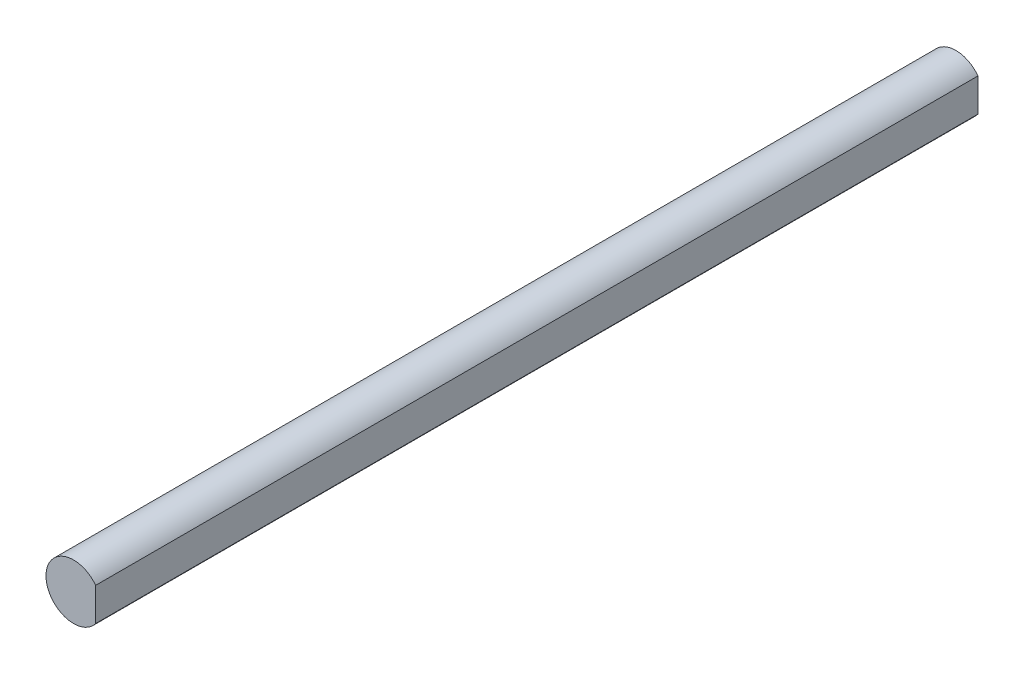
ISO-10303-21;
HEADER;
FILE_DESCRIPTION(('STEP AP214'),'2;1');
FILE_NAME('part.step','',(''),(''),'','','');
FILE_SCHEMA(('AUTOMOTIVE_DESIGN { 1 0 10303 214 1 1 1 1 }'));
ENDSEC;
DATA;
#1=APPLICATION_CONTEXT('core data for automotive mechanical design processes');
#2=APPLICATION_PROTOCOL_DEFINITION('international standard','automotive_design',2000,#1);
#3=PRODUCT_CONTEXT('',#1,'mechanical');
#4=PRODUCT('Part','Part','',(#3));
#5=PRODUCT_RELATED_PRODUCT_CATEGORY('part','',(#4));
#6=PRODUCT_DEFINITION_FORMATION('','',#4);
#7=PRODUCT_DEFINITION_CONTEXT('part definition',#1,'design');
#8=PRODUCT_DEFINITION('design','',#6,#7);
#9=PRODUCT_DEFINITION_SHAPE('','',#8);
#10=(LENGTH_UNIT() NAMED_UNIT(*) SI_UNIT(.MILLI.,.METRE.));
#11=(NAMED_UNIT(*) PLANE_ANGLE_UNIT() SI_UNIT($,.RADIAN.));
#12=(NAMED_UNIT(*) SI_UNIT($,.STERADIAN.) SOLID_ANGLE_UNIT());
#13=UNCERTAINTY_MEASURE_WITH_UNIT(LENGTH_MEASURE(1.E-05),#10,'distance_accuracy_value','');
#14=(GEOMETRIC_REPRESENTATION_CONTEXT(3) GLOBAL_UNCERTAINTY_ASSIGNED_CONTEXT((#13)) GLOBAL_UNIT_ASSIGNED_CONTEXT((#10,
#11,#12)) REPRESENTATION_CONTEXT('',''));
#15=CARTESIAN_POINT('',(0.,0.,0.));
#16=DIRECTION('',(0.,0.,1.));
#17=DIRECTION('',(1.,0.,0.));
#18=AXIS2_PLACEMENT_3D('',#15,#16,#17);
#19=CARTESIAN_POINT('',(0.,0.,101.6));
#20=DIRECTION('',(0.,0.,-1.));
#21=DIRECTION('',(-1.,0.,0.));
#22=AXIS2_PLACEMENT_3D('',#19,#20,#21);
#23=CYLINDRICAL_SURFACE('',#22,3.175);
#24=CARTESIAN_POINT('',(0.,0.,101.6));
#25=DIRECTION('',(0.,0.,1.));
#26=DIRECTION('',(1.,0.,0.));
#27=AXIS2_PLACEMENT_3D('',#24,#25,#26);
#28=CIRCLE('',#27,3.175);
#29=CARTESIAN_POINT('',(2.54,1.905,101.6));
#30=VERTEX_POINT('',#29);
#31=CARTESIAN_POINT('',(2.54,-1.905,101.6));
#32=VERTEX_POINT('',#31);
#33=EDGE_CURVE('E11',#30,#32,#28,.T.);
#34=ORIENTED_EDGE('',*,*,#33,.F.);
#35=DIRECTION('',(0.,0.,1.));
#36=VECTOR('',#35,1.);
#37=CARTESIAN_POINT('',(2.54,1.905,0.));
#38=LINE('',#37,#36);
#39=CARTESIAN_POINT('',(2.54,1.905,0.));
#40=VERTEX_POINT('',#39);
#41=EDGE_CURVE('E61',#40,#30,#38,.T.);
#42=ORIENTED_EDGE('',*,*,#41,.F.);
#43=CARTESIAN_POINT('',(0.,0.,0.));
#44=DIRECTION('',(0.,0.,1.));
#45=DIRECTION('',(1.,0.,0.));
#46=AXIS2_PLACEMENT_3D('',#43,#44,#45);
#47=CIRCLE('',#46,3.175);
#48=CARTESIAN_POINT('',(2.54,-1.905,0.));
#49=VERTEX_POINT('',#48);
#50=EDGE_CURVE('E41',#40,#49,#47,.T.);
#51=ORIENTED_EDGE('',*,*,#50,.T.);
#52=DIRECTION('',(0.,0.,1.));
#53=VECTOR('',#52,1.);
#54=CARTESIAN_POINT('',(2.54,-1.905,0.));
#55=LINE('',#54,#53);
#56=EDGE_CURVE('E52',#49,#32,#55,.T.);
#57=ORIENTED_EDGE('',*,*,#56,.T.);
#58=EDGE_LOOP('',(#34,#42,#51,#57));
#59=FACE_BOUND('',#58,.T.);
#60=ADVANCED_FACE('F38',(#59),#23,.T.);
#61=CARTESIAN_POINT('',(0.,0.,101.6));
#62=DIRECTION('',(0.,0.,1.));
#63=DIRECTION('',(1.,0.,0.));
#64=AXIS2_PLACEMENT_3D('',#61,#62,#63);
#65=PLANE('',#64);
#66=DIRECTION('',(0.,-1.,0.));
#67=VECTOR('',#66,1.);
#68=CARTESIAN_POINT('',(2.54,1.905,101.6));
#69=LINE('',#68,#67);
#70=EDGE_CURVE('E64',#30,#32,#69,.T.);
#71=ORIENTED_EDGE('',*,*,#70,.F.);
#72=ORIENTED_EDGE('',*,*,#33,.T.);
#73=EDGE_LOOP('',(#71,#72));
#74=FACE_BOUND('',#73,.T.);
#75=ADVANCED_FACE('F71',(#74),#65,.T.);
#76=CARTESIAN_POINT('',(0.,0.,0.));
#77=DIRECTION('',(0.,0.,1.));
#78=DIRECTION('',(1.,0.,0.));
#79=AXIS2_PLACEMENT_3D('',#76,#77,#78);
#80=PLANE('',#79);
#81=ORIENTED_EDGE('',*,*,#50,.F.);
#82=DIRECTION('',(0.,-1.,0.));
#83=VECTOR('',#82,1.);
#84=CARTESIAN_POINT('',(2.54,1.905,0.));
#85=LINE('',#84,#83);
#86=EDGE_CURVE('E57',#40,#49,#85,.T.);
#87=ORIENTED_EDGE('',*,*,#86,.T.);
#88=EDGE_LOOP('',(#81,#87));
#89=FACE_BOUND('',#88,.T.);
#90=ADVANCED_FACE('F76',(#89),#80,.F.);
#91=CARTESIAN_POINT('',(2.54,1.905,0.));
#92=DIRECTION('',(-1.,0.,0.));
#93=DIRECTION('',(0.,0.,1.));
#94=AXIS2_PLACEMENT_3D('',#91,#92,#93);
#95=PLANE('',#94);
#96=ORIENTED_EDGE('',*,*,#70,.T.);
#97=ORIENTED_EDGE('',*,*,#56,.F.);
#98=ORIENTED_EDGE('',*,*,#86,.F.);
#99=ORIENTED_EDGE('',*,*,#41,.T.);
#100=EDGE_LOOP('',(#96,#97,#98,#99));
#101=FACE_BOUND('',#100,.T.);
#102=ADVANCED_FACE('F63',(#101),#95,.F.);
#103=CLOSED_SHELL('',(#60,#75,#90,#102));
#104=MANIFOLD_SOLID_BREP('B2',#103);
#105=ADVANCED_BREP_SHAPE_REPRESENTATION('',(#18,#104),#14);
#106=SHAPE_DEFINITION_REPRESENTATION(#9,#105);
ENDSEC;
END-ISO-10303-21;
